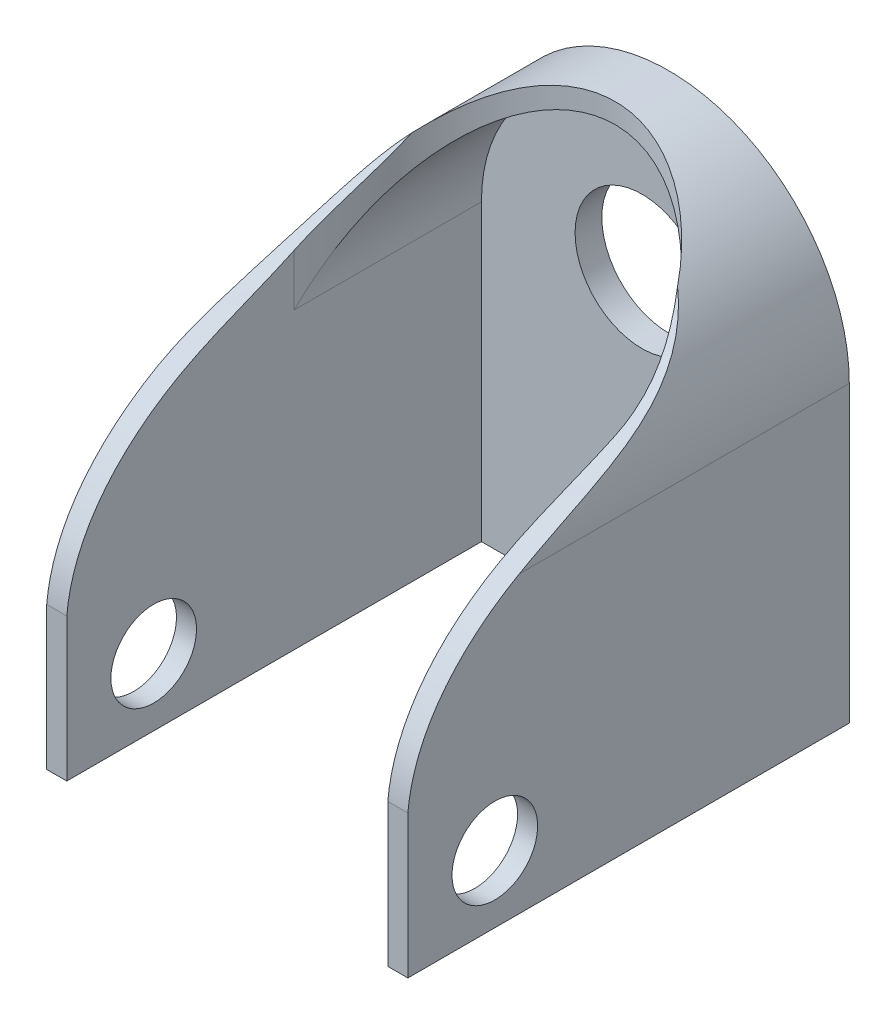
ISO-10303-21;
HEADER;
FILE_DESCRIPTION(('STEP AP214'),'2;1');
FILE_NAME('part.step','',(''),(''),'','','');
FILE_SCHEMA(('AUTOMOTIVE_DESIGN { 1 0 10303 214 1 1 1 1 }'));
ENDSEC;
DATA;
#1=APPLICATION_CONTEXT('core data for automotive mechanical design processes');
#2=APPLICATION_PROTOCOL_DEFINITION('international standard','automotive_design',2000,#1);
#3=PRODUCT_CONTEXT('',#1,'mechanical');
#4=PRODUCT('Part','Part','',(#3));
#5=PRODUCT_RELATED_PRODUCT_CATEGORY('part','',(#4));
#6=PRODUCT_DEFINITION_FORMATION('','',#4);
#7=PRODUCT_DEFINITION_CONTEXT('part definition',#1,'design');
#8=PRODUCT_DEFINITION('design','',#6,#7);
#9=PRODUCT_DEFINITION_SHAPE('','',#8);
#10=(LENGTH_UNIT() NAMED_UNIT(*) SI_UNIT(.MILLI.,.METRE.));
#11=(NAMED_UNIT(*) PLANE_ANGLE_UNIT() SI_UNIT($,.RADIAN.));
#12=(NAMED_UNIT(*) SI_UNIT($,.STERADIAN.) SOLID_ANGLE_UNIT());
#13=UNCERTAINTY_MEASURE_WITH_UNIT(LENGTH_MEASURE(1.E-05),#10,'distance_accuracy_value','');
#14=(GEOMETRIC_REPRESENTATION_CONTEXT(3) GLOBAL_UNCERTAINTY_ASSIGNED_CONTEXT((#13)) GLOBAL_UNIT_ASSIGNED_CONTEXT((#10,
#11,#12)) REPRESENTATION_CONTEXT('',''));
#15=CARTESIAN_POINT('',(0.,0.,0.));
#16=DIRECTION('',(0.,0.,1.));
#17=DIRECTION('',(1.,0.,0.));
#18=AXIS2_PLACEMENT_3D('',#15,#16,#17);
#19=CARTESIAN_POINT('',(13.5,22.,2.));
#20=DIRECTION('',(0.,0.,-1.));
#21=DIRECTION('',(-1.,0.,0.));
#22=AXIS2_PLACEMENT_3D('',#19,#20,#21);
#23=CYLINDRICAL_SURFACE('',#22,13.5);
#24=DIRECTION('',(0.,0.,-1.));
#25=VECTOR('',#24,1.);
#26=CARTESIAN_POINT('',(0.,22.,2.));
#27=LINE('',#26,#25);
#28=CARTESIAN_POINT('',(0.,22.0000000004221,24.6709792303414));
#29=VERTEX_POINT('',#28);
#30=CARTESIAN_POINT('',(0.,22.,0.));
#31=VERTEX_POINT('',#30);
#32=EDGE_CURVE('E198',#29,#31,#27,.T.);
#33=ORIENTED_EDGE('',*,*,#32,.F.);
#34=CARTESIAN_POINT('',(0.,22.,24.6709792310882));
#35=CARTESIAN_POINT('',(4.17203860960988E-06,22.0877378636198,24.5157433278381));
#36=CARTESIAN_POINT('',(0.000854723526788517,22.1736299451535,24.3594800205761));
#37=CARTESIAN_POINT('',(0.00406945856939409,22.3420071177185,24.0451687181609));
#38=CARTESIAN_POINT('',(0.00643344164084357,22.4244926584711,23.8871209621159));
#39=CARTESIAN_POINT('',(0.0155993873603406,22.6692252262729,23.4068665210544));
#40=CARTESIAN_POINT('',(0.0244671123845461,22.8266749503702,23.082251661167));
#41=CARTESIAN_POINT('',(0.0467550481397332,23.1331531745115,22.4251328165439));
#42=CARTESIAN_POINT('',(0.0602219684453914,23.2820761985686,22.0925818129647));
#43=CARTESIAN_POINT('',(0.0912496365364503,23.5738867683632,21.421779674441));
#44=CARTESIAN_POINT('',(0.10884328623355,23.7167142878531,21.0835041452644));
#45=CARTESIAN_POINT('',(0.148047091669684,23.9989402102766,20.4035845925255));
#46=CARTESIAN_POINT('',(0.169678810650676,24.1383154264326,20.0619322755097));
#47=CARTESIAN_POINT('',(0.217270678808816,24.4164120762317,19.3776776509112));
#48=CARTESIAN_POINT('',(0.243241380844388,24.5551310467493,19.0350750801224));
#49=CARTESIAN_POINT('',(0.302323800566631,24.8451460819324,18.3260542204603));
#50=CARTESIAN_POINT('',(0.33582030632161,24.9966166416701,17.9597380900108));
#51=CARTESIAN_POINT('',(0.410035974075327,25.3057589213072,17.2317447296482));
#52=CARTESIAN_POINT('',(0.450733009177463,25.4634105236308,16.8700568282734));
#53=CARTESIAN_POINT('',(0.541353887388601,25.7883793631412,16.1543744246927));
#54=CARTESIAN_POINT('',(0.591230132176295,25.9556438091683,15.8003503094171));
#55=CARTESIAN_POINT('',(0.702841202065188,26.3030021079695,15.1030344015129));
#56=CARTESIAN_POINT('',(0.764507024713626,26.4830176499849,14.7596930512014));
#57=CARTESIAN_POINT('',(0.903036195182093,26.8586435563419,14.086608640154));
#58=CARTESIAN_POINT('',(0.979832807383709,27.0541832662343,13.7568132887012));
#59=CARTESIAN_POINT('',(1.10945245006669,27.3606493522535,13.2744312007386));
#60=CARTESIAN_POINT('',(1.15506178672538,27.4649946713903,13.1156928412962));
#61=CARTESIAN_POINT('',(1.25160800068987,27.6780798169146,12.8028645358635));
#62=CARTESIAN_POINT('',(1.30254424087137,27.7868191168075,12.6487740367999));
#63=CARTESIAN_POINT('',(1.41398229050113,28.0162732035255,12.3353132110856));
#64=CARTESIAN_POINT('',(1.47490218961736,28.1372958979781,12.1763158357213));
#65=CARTESIAN_POINT('',(1.60410896830235,28.3841374407834,11.8647146935877));
#66=CARTESIAN_POINT('',(1.67240744173599,28.5099636302025,11.7121215276866));
#67=CARTESIAN_POINT('',(1.81685947478887,28.7657822952747,11.4141725436896));
#68=CARTESIAN_POINT('',(1.89301662190714,28.8957766548746,11.2688200762802));
#69=CARTESIAN_POINT('',(2.05246452921929,29.1573071929945,10.9880031979514));
#70=CARTESIAN_POINT('',(2.13563819738329,29.2887950186243,10.8524274143008));
#71=CARTESIAN_POINT('',(2.31031810185896,29.5542206031785,10.5894049731213));
#72=CARTESIAN_POINT('',(2.40182111035751,29.6881573971264,10.4619551988586));
#73=CARTESIAN_POINT('',(2.59335518257139,29.957536375937,10.2154765217611));
#74=CARTESIAN_POINT('',(2.6933818422584,30.0929777523229,10.0964433276996));
#75=CARTESIAN_POINT('',(2.84621738604934,30.2917582340709,9.92832480068025));
#76=CARTESIAN_POINT('',(2.89565035905257,30.3548964701976,9.87589463701701));
#77=CARTESIAN_POINT('',(2.99637516500738,30.4811782957301,9.77288078060569));
#78=CARTESIAN_POINT('',(3.04766670276674,30.5443218827105,9.72229679717192));
#79=CARTESIAN_POINT('',(3.15210491637062,30.6705118168614,9.62297114428572));
#80=CARTESIAN_POINT('',(3.20525145677479,30.7335581707817,9.57422934086816));
#81=CARTESIAN_POINT('',(3.31383722426081,30.859971094624,9.47818209166841));
#82=CARTESIAN_POINT('',(3.36929170594742,30.923336036908,9.43089174575264));
#83=CARTESIAN_POINT('',(3.48206793143075,31.0497630708563,9.33815335544271));
#84=CARTESIAN_POINT('',(3.53938982412805,31.1128251379082,9.29270545861043));
#85=CARTESIAN_POINT('',(3.65588375940127,31.2385456983721,9.20362851089251));
#86=CARTESIAN_POINT('',(3.71505607493924,31.301204130583,9.1599997305868));
#87=CARTESIAN_POINT('',(3.77513864962858,31.3636035646567,9.11727351153147));
#88=B_SPLINE_CURVE_WITH_KNOTS('',3,(#34,#35,#36,#37,#38,#39,#40,#41,#42,#43,#44,#45,#46,#47,#48,
#49,#50,#51,#52,#53,#54,#55,#56,#57,#58,#59,#60,#61,#62,#63,#64,#65,#66,#67,#68,#69,#70,#71,#72,
#73,#74,#75,#76,#77,#78,#79,#80,#81,#82,#83,#84,#85,#86,#87),.UNSPECIFIED.,.F.,.F.,(4,2,2,2,2,2,
2,2,2,2,2,2,2,2,2,2,2,2,2,2,2,2,2,2,2,2,4),(0.,0.534907905365416,1.06974496659949,
2.1521394327608,3.24587081683298,4.3486380359988,5.4574718210032,6.56904274676088,
7.76238897812063,8.9521298616894,10.1358668664339,11.3128767592051,12.4848070964805,
13.0707427226402,13.6566083479457,14.2830316223099,14.9104539119127,15.53816389878,
16.156930814128,16.7754589555074,17.3936694292958,17.6810619609112,17.9684090449043,
18.2557351923707,18.5454231095328,18.8351341821686,19.1248881945363),.UNSPECIFIED.);
#89=CARTESIAN_POINT('',(3.56000109905665,31.1349013048546,9.27717158859123));
#90=VERTEX_POINT('',#89);
#91=EDGE_CURVE('E270',#29,#90,#88,.T.);
#92=ORIENTED_EDGE('',*,*,#91,.T.);
#93=CARTESIAN_POINT('',(25.5,28.1846584384265,16.));
#94=CARTESIAN_POINT('',(25.5000019287082,28.1846500651789,15.9058672038379));
#95=CARTESIAN_POINT('',(25.4988919941462,28.1868087551287,15.811751657344));
#96=CARTESIAN_POINT('',(25.4944691857164,28.1953808457043,15.6237846185444));
#97=CARTESIAN_POINT('',(25.4911567505461,28.2017933990385,15.5299330773914));
#98=CARTESIAN_POINT('',(25.4779703448871,28.227247470784,15.2495758654299));
#99=CARTESIAN_POINT('',(25.4648470265256,28.2525062837932,15.0637491301028));
#100=CARTESIAN_POINT('',(25.4306356440936,28.3175338613273,14.6988602315224));
#101=CARTESIAN_POINT('',(25.4096906862344,28.3570415068287,14.5197366070789));
#102=CARTESIAN_POINT('',(25.3603272418741,28.4486700194743,14.1657124844965));
#103=CARTESIAN_POINT('',(25.3319034975715,28.5007997582477,13.9908150523143));
#104=CARTESIAN_POINT('',(25.2529827977488,28.6427949726174,13.5639541169116));
#105=CARTESIAN_POINT('',(25.198411648768,28.7388291941476,13.3147997321441));
#106=CARTESIAN_POINT('',(25.0756667762567,28.9475608874944,12.8271055653342));
#107=CARTESIAN_POINT('',(25.0074861165098,29.0602668486057,12.5885712720526));
#108=CARTESIAN_POINT('',(24.8578615625926,29.2985589148929,12.1192492811446));
#109=CARTESIAN_POINT('',(24.7762947707861,29.42425994333,11.8885598534578));
#110=CARTESIAN_POINT('',(24.6010559049609,29.6838232190666,11.436523619675));
#111=CARTESIAN_POINT('',(24.5073794203296,29.8176884305085,11.2151802567786));
#112=CARTESIAN_POINT('',(24.243758955405,30.1791808967698,10.6402582542807));
#113=CARTESIAN_POINT('',(24.0637671872826,30.4112875805343,10.2940656573392));
#114=CARTESIAN_POINT('',(23.6727078324353,30.8802885205061,9.62294614980076));
#115=CARTESIAN_POINT('',(23.461622241533,31.1171854813895,9.29803171836781));
#116=CARTESIAN_POINT('',(23.0089807462059,31.5883115717858,8.67001828214708));
#117=CARTESIAN_POINT('',(22.7675148549411,31.8225464405597,8.36685882438066));
#118=CARTESIAN_POINT('',(22.2532958906163,32.2834322744987,7.78226169957605));
#119=CARTESIAN_POINT('',(21.9805577124682,32.5100867842682,7.50081379735605));
#120=CARTESIAN_POINT('',(21.4716703733793,32.8985926029293,7.02540723468017));
#121=CARTESIAN_POINT('',(21.2421380505722,33.0630855579114,6.82650693270028));
#122=CARTESIAN_POINT('',(20.764469860437,33.3824422596035,6.44379154789719));
#123=CARTESIAN_POINT('',(20.5163343794699,33.5373062061722,6.25997615194795));
#124=CARTESIAN_POINT('',(20.0018902119072,33.8348482512479,5.90930010904159));
#125=CARTESIAN_POINT('',(19.7356009517289,33.977539019188,5.74242179934897));
#126=CARTESIAN_POINT('',(19.1851334179649,34.2483993962913,5.42740556306691));
#127=CARTESIAN_POINT('',(18.9009589091986,34.3765720456995,5.2792637121076));
#128=CARTESIAN_POINT('',(18.3719755483005,34.5928191107033,5.03040042833197));
#129=CARTESIAN_POINT('',(18.1300909005594,34.6838665667663,4.92603627321097));
#130=CARTESIAN_POINT('',(17.6361729990152,34.8534124045098,4.73224004091372));
#131=CARTESIAN_POINT('',(17.3841418899355,34.9319134209582,4.64280482846524));
#132=CARTESIAN_POINT('',(16.87115988742,35.0750201956105,4.4801193932996));
#133=CARTESIAN_POINT('',(16.6102125454497,35.1396314132441,4.4068628112096));
#134=CARTESIAN_POINT('',(16.0808137633627,35.2537810139578,4.27764406614004));
#135=CARTESIAN_POINT('',(15.8123622411978,35.303319232164,4.22168209233489));
#136=CARTESIAN_POINT('',(15.2682491907479,35.3865405037924,4.12776584752341));
#137=CARTESIAN_POINT('',(14.9925549467279,35.4201302176172,4.08991757805108));
#138=CARTESIAN_POINT('',(14.4376553910786,35.4702784388921,4.03343948970118));
#139=CARTESIAN_POINT('',(14.1584500710765,35.4868369057203,4.01480971666225));
#140=CARTESIAN_POINT('',(13.5989882436864,35.502536692255,3.99714561086045));
#141=CARTESIAN_POINT('',(13.3187319703418,35.5016816834477,3.99810714743306));
#142=CARTESIAN_POINT('',(12.7595805940726,35.4825821062568,4.01959746050134));
#143=CARTESIAN_POINT('',(12.4806854091194,35.4643385991638,4.04012504280173));
#144=CARTESIAN_POINT('',(11.9520991950442,35.4133482813574,4.09756043732118));
#145=CARTESIAN_POINT('',(11.702078504732,35.3820873978939,4.13279067147909));
#146=CARTESIAN_POINT('',(11.2067559585792,35.3061565411928,4.21848072522889));
#147=CARTESIAN_POINT('',(10.9614537517756,35.2614875693913,4.26893940742551));
#148=CARTESIAN_POINT('',(10.4769844719692,35.1595084492353,4.38434710629343));
#149=CARTESIAN_POINT('',(10.2378173530673,35.1021983954847,4.44929601452215));
#150=CARTESIAN_POINT('',(9.7667178474714,34.9758282219541,4.59284101308944));
#151=CARTESIAN_POINT('',(9.5347882220516,34.9067636808798,4.67144223879507));
#152=CARTESIAN_POINT('',(9.0653279120421,34.7533641688074,4.84651675129956));
#153=CARTESIAN_POINT('',(8.82831410603396,34.6683560433673,4.94378612202236));
#154=CARTESIAN_POINT('',(8.36437572182607,34.487491532329,5.15149595600148));
#155=CARTESIAN_POINT('',(8.13745512447375,34.3916309183465,5.26194155393315));
#156=CARTESIAN_POINT('',(7.47289852616349,34.0896833925173,5.61133869327195));
#157=CARTESIAN_POINT('',(7.05114239420869,33.8691217845885,5.86847415674464));
#158=CARTESIAN_POINT('',(6.34839580595662,33.4555304780208,6.35677777324836));
#159=CARTESIAN_POINT('',(6.05781352558109,33.2684680459794,6.57952813818692));
#160=CARTESIAN_POINT('',(5.50278068769741,32.8815827182874,7.04590386985167));
#161=CARTESIAN_POINT('',(5.23834225433901,32.6817539723457,7.28953882488377));
#162=CARTESIAN_POINT('',(4.73453897316457,32.2724157452569,7.79664347218671));
#163=CARTESIAN_POINT('',(4.49528685714384,32.0628683242383,8.0601939658244));
#164=CARTESIAN_POINT('',(4.04282858164966,31.6388782602887,8.60491710553869));
#165=CARTESIAN_POINT('',(3.82961617300375,31.4244368065781,8.88608549895681));
#166=CARTESIAN_POINT('',(3.42413002423575,30.9898377139829,9.47259739296509));
#167=CARTESIAN_POINT('',(3.23247215558806,30.7696650318974,9.77835586720493));
#168=CARTESIAN_POINT('',(2.87595466378421,30.3341991525317,10.408847248661));
#169=CARTESIAN_POINT('',(2.71111574354699,30.1189098342579,10.7335945539236));
#170=CARTESIAN_POINT('',(2.40974824837926,29.7020702743706,11.402156352098));
#171=CARTESIAN_POINT('',(2.27308466400711,29.5004577729922,11.7458694130882));
#172=CARTESIAN_POINT('',(2.09012828415842,29.2164824010371,12.2784537552214));
#173=CARTESIAN_POINT('',(2.03284454848477,29.1249486345442,12.4587012269031));
#174=CARTESIAN_POINT('',(1.92599005526151,28.9500184070649,12.825295707467));
#175=CARTESIAN_POINT('',(1.87641620832171,28.8666186917454,13.0116402368108));
#176=CARTESIAN_POINT('',(1.79113680838728,28.720030584386,13.3671940820815));
#177=CARTESIAN_POINT('',(1.75447400960815,28.6556182909759,13.535666154024));
#178=CARTESIAN_POINT('',(1.68792359267128,28.5367798716078,13.8774646227559));
#179=CARTESIAN_POINT('',(1.65803643076705,28.4823544181841,14.0507913455623));
#180=CARTESIAN_POINT('',(1.60568098103238,28.385780212015,14.4011261334822));
#181=CARTESIAN_POINT('',(1.58318043635548,28.3435781782339,14.578114504941));
#182=CARTESIAN_POINT('',(1.54595124996513,28.2731427104629,14.9355938769221));
#183=CARTESIAN_POINT('',(1.53121718707214,28.2448995337367,15.1160823428175));
#184=CARTESIAN_POINT('',(1.51375125563396,28.2112849254432,15.4139759328944));
#185=CARTESIAN_POINT('',(1.50860897538896,28.2013415175076,15.5307399152573));
#186=CARTESIAN_POINT('',(1.50172640351485,28.1880083927186,15.7649933794294));
#187=CARTESIAN_POINT('',(1.49999350182046,28.1846329122274,15.8824838846797));
#188=CARTESIAN_POINT('',(1.5,28.1846584384265,16.));
#189=B_SPLINE_CURVE_WITH_KNOTS('',3,(#93,#94,#95,#96,#97,#98,#99,#100,#101,#102,#103,#104,#105,
#106,#107,#108,#109,#110,#111,#112,#113,#114,#115,#116,#117,#118,#119,#120,#121,#122,#123,#124,
#125,#126,#127,#128,#129,#130,#131,#132,#133,#134,#135,#136,#137,#138,#139,#140,#141,#142,#143,
#144,#145,#146,#147,#148,#149,#150,#151,#152,#153,#154,#155,#156,#157,#158,#159,#160,#161,#162,
#163,#164,#165,#166,#167,#168,#169,#170,#171,#172,#173,#174,#175,#176,#177,#178,#179,#180,#181,
#182,#183,#184,#185,#186,#187,#188),.UNSPECIFIED.,.F.,.F.,(4,2,2,2,2,2,2,2,2,2,2,2,2,2,2,2,2,2,
2,2,2,2,2,2,2,2,2,2,2,2,2,2,2,2,2,2,2,2,2,2,2,2,2,2,2,2,2,4),(0.,0.282334125647721,
0.564612032380173,1.12761968346313,1.68079447468849,2.23435920763545,3.05058273932272,
3.86722333414956,4.69183045354452,5.51673876341833,6.87688854664192,8.23782901247381,
9.5948281605371,10.9511836373489,11.9865368838153,13.0218686334227,14.0561093537447,
15.0901330913154,15.9255264558189,16.7607441555103,17.5956329675482,18.4305309115664,
19.2702566876271,20.10998446654,20.9495351976748,21.7890346908969,22.551431380466,
23.3137711415893,24.0761051976722,24.8387266318591,25.6477175630692,26.4570247880373,
28.0745549543644,29.3065627942897,30.5391393211377,31.7770170948549,33.0145972086953,
34.281502619415,35.5493814260235,36.8110359167384,37.4410862561681,38.0708834772308,
38.6226556993484,39.1744650653221,39.7238316306712,40.2728142162466,40.624493319711,
40.9769338624895),.UNSPECIFIED.);
#190=CARTESIAN_POINT('',(23.4399989009539,31.1349013048327,9.27717158860685));
#191=VERTEX_POINT('',#190);
#192=EDGE_CURVE('E170',#191,#90,#189,.T.);
#193=ORIENTED_EDGE('',*,*,#192,.F.);
#194=CARTESIAN_POINT('',(23.2248613503714,31.3636035646567,9.11727351153147));
#195=CARTESIAN_POINT('',(23.3290989264238,31.2553549596672,9.19138800850632));
#196=CARTESIAN_POINT('',(23.4305874572624,31.1463230278564,9.26823059135399));
#197=CARTESIAN_POINT('',(23.6279251806906,30.927306126632,9.42741245124776));
#198=CARTESIAN_POINT('',(23.7237772605064,30.8173216788537,9.50974886715769));
#199=CARTESIAN_POINT('',(23.9097775272953,30.5969373295245,9.68000676532836));
#200=CARTESIAN_POINT('',(23.9999276184685,30.4865375798539,9.76792636319819));
#201=CARTESIAN_POINT('',(24.1745153483332,30.265864189647,9.94937697133699));
#202=CARTESIAN_POINT('',(24.2589537037486,30.1555905350016,10.04290727477));
#203=CARTESIAN_POINT('',(24.4199704173167,29.9386401738972,10.2329770764493));
#204=CARTESIAN_POINT('',(24.4966982560948,29.8319459151936,10.3293699958239));
#205=CARTESIAN_POINT('',(24.6448304800147,29.6196787640445,10.5273394337629));
#206=CARTESIAN_POINT('',(24.7162348706334,29.5141058704453,10.628915946994));
#207=CARTESIAN_POINT('',(24.8538304195477,29.3045361994933,10.8370990277187));
#208=CARTESIAN_POINT('',(24.9200215882904,29.2005394189823,10.9437055851314));
#209=CARTESIAN_POINT('',(25.0473389200009,28.994542520971,11.161727946493));
#210=CARTESIAN_POINT('',(25.1084656247321,28.8925421907974,11.273143234091));
#211=CARTESIAN_POINT('',(25.2452712186407,28.6575303041373,11.5381523231156));
#212=CARTESIAN_POINT('',(25.319079610247,28.5254154383034,11.6935124185708));
#213=CARTESIAN_POINT('',(25.4586552303597,28.2659615732513,12.0116617151462));
#214=CARTESIAN_POINT('',(25.5244215693667,28.1386231034092,12.1744517353312));
#215=CARTESIAN_POINT('',(25.6485543460804,27.8891462405598,12.5067065479117));
#216=CARTESIAN_POINT('',(25.7069202503526,27.76700822283,12.6761718203169));
#217=CARTESIAN_POINT('',(25.8178435448608,27.5261740402654,13.023833693304));
#218=CARTESIAN_POINT('',(25.8702888890081,27.4075682229834,13.2021283515964));
#219=CARTESIAN_POINT('',(25.9689656247207,27.1759772699645,13.5639509017219));
#220=CARTESIAN_POINT('',(26.0151980023755,27.062991244081,13.7474779574784));
#221=CARTESIAN_POINT('',(26.1021552310196,26.8424903979493,14.118927776668));
#222=CARTESIAN_POINT('',(26.1428826507491,26.7349730406043,14.30684844159));
#223=CARTESIAN_POINT('',(26.2370287790382,26.4771239056512,14.7730654221896));
#224=CARTESIAN_POINT('',(26.2877602510837,26.3296385121625,15.0534784530913));
#225=CARTESIAN_POINT('',(26.3809366426796,26.0440106190953,15.6203403246609));
#226=CARTESIAN_POINT('',(26.4233808873267,25.9058688810529,15.906789654816));
#227=CARTESIAN_POINT('',(26.5016201180341,25.6369636702892,16.4844573964418));
#228=CARTESIAN_POINT('',(26.5374063578218,25.5062100576928,16.7756815417739));
#229=CARTESIAN_POINT('',(26.603605937033,25.2500815454995,17.3616346563116));
#230=CARTESIAN_POINT('',(26.6340104585575,25.1247157235873,17.6563685483171));
#231=CARTESIAN_POINT('',(26.6904171054254,24.8773267158331,18.2481013910233));
#232=CARTESIAN_POINT('',(26.7164133586156,24.7553081672755,18.5451028207144));
#233=CARTESIAN_POINT('',(26.7647040047263,24.5125588768866,19.1401513058399));
#234=CARTESIAN_POINT('',(26.7869959829903,24.3918290227006,19.4381989150001));
#235=CARTESIAN_POINT('',(26.8271090483185,24.1567385967544,20.0165675507681));
#236=CARTESIAN_POINT('',(26.8451166072637,24.0424237344733,20.296894203029));
#237=CARTESIAN_POINT('',(26.8784335117949,23.8113885393169,20.8564460563319));
#238=CARTESIAN_POINT('',(26.8937450999317,23.6946702967545,21.1356719821328));
#239=CARTESIAN_POINT('',(26.9216628687744,23.4571379912897,21.6920287789573));
#240=CARTESIAN_POINT('',(26.9342730663573,23.3363303233951,21.9691621610959));
#241=CARTESIAN_POINT('',(26.9565802055813,23.0889553163974,22.5203554779764));
#242=CARTESIAN_POINT('',(26.9662825441709,22.9623991557177,22.7944201861628));
#243=CARTESIAN_POINT('',(26.9823753515964,22.7018836827062,23.338531655992));
#244=CARTESIAN_POINT('',(26.9887717607122,22.5679381309121,23.6085847715403));
#245=CARTESIAN_POINT('',(26.9975594915647,22.291088234296,24.1437151677065));
#246=CARTESIAN_POINT('',(26.9999554426324,22.1481944434123,24.4087978482285));
#247=CARTESIAN_POINT('',(27.,22.,24.6709792310882));
#248=B_SPLINE_CURVE_WITH_KNOTS('',3,(#194,#195,#196,#197,#198,#199,#200,#201,#202,#203,#204,
#205,#206,#207,#208,#209,#210,#211,#212,#213,#214,#215,#216,#217,#218,#219,#220,#221,#222,#223,
#224,#225,#226,#227,#228,#229,#230,#231,#232,#233,#234,#235,#236,#237,#238,#239,#240,#241,#242,
#243,#244,#245,#246,#247),.UNSPECIFIED.,.F.,.F.,(4,2,2,2,2,2,2,2,2,2,2,2,2,2,2,2,2,2,2,2,2,2,2,
2,2,2,4),(0.,0.502636284997042,1.00501281465462,1.50722067822837,2.00936540605088,
2.49813070913571,2.98689550935586,3.47565933007492,3.96437079834315,4.6146601675509,
5.26502139774742,5.91542948034799,6.57659581793983,7.23765709444379,7.89840883173382,
8.86061915023295,9.82290779750942,10.7864517626587,11.7515601593387,12.7179442243475,
13.6849557829304,14.5947622199397,15.5038082531515,16.411493035827,17.3174825836123,
18.2218384887046,19.1251471457761),.UNSPECIFIED.);
#249=CARTESIAN_POINT('',(27.,22.0000000004221,24.6709792303414));
#250=VERTEX_POINT('',#249);
#251=EDGE_CURVE('E62',#191,#250,#248,.T.);
#252=ORIENTED_EDGE('',*,*,#251,.T.);
#253=DIRECTION('',(0.,0.,-1.));
#254=VECTOR('',#253,1.);
#255=CARTESIAN_POINT('',(27.,22.,2.));
#256=LINE('',#255,#254);
#257=CARTESIAN_POINT('',(27.,22.,0.));
#258=VERTEX_POINT('',#257);
#259=EDGE_CURVE('E145',#250,#258,#256,.T.);
#260=ORIENTED_EDGE('',*,*,#259,.T.);
#261=CARTESIAN_POINT('',(13.5,22.,0.));
#262=DIRECTION('',(0.,0.,1.));
#263=DIRECTION('',(-1.,0.,0.));
#264=AXIS2_PLACEMENT_3D('',#261,#262,#263);
#265=CIRCLE('',#264,13.5);
#266=EDGE_CURVE('E192',#258,#31,#265,.T.);
#267=ORIENTED_EDGE('',*,*,#266,.T.);
#268=EDGE_LOOP('',(#33,#92,#193,#252,#260,#267));
#269=FACE_BOUND('',#268,.T.);
#270=ADVANCED_FACE('F39',(#269),#23,.T.);
#271=CARTESIAN_POINT('',(13.5,22.,33.));
#272=DIRECTION('',(0.,0.,-1.));
#273=DIRECTION('',(-1.,0.,0.));
#274=AXIS2_PLACEMENT_3D('',#271,#272,#273);
#275=CYLINDRICAL_SURFACE('',#274,12.);
#276=CARTESIAN_POINT('',(13.5,22.,16.));
#277=DIRECTION('',(0.,-0.707106781186547,-0.707106781186547));
#278=DIRECTION('',(0.,0.707106781186547,-0.707106781186547));
#279=AXIS2_PLACEMENT_3D('',#276,#277,#278);
#280=ELLIPSE('',#279,16.9705627484771,12.);
#281=CARTESIAN_POINT('',(1.5,22.,16.));
#282=VERTEX_POINT('',#281);
#283=CARTESIAN_POINT('',(25.5,22.,16.));
#284=VERTEX_POINT('',#283);
#285=EDGE_CURVE('E280',#282,#284,#280,.T.);
#286=ORIENTED_EDGE('',*,*,#285,.F.);
#287=DIRECTION('',(0.,0.,-1.));
#288=VECTOR('',#287,1.);
#289=CARTESIAN_POINT('',(1.5,22.,33.));
#290=LINE('',#289,#288);
#291=CARTESIAN_POINT('',(1.5,22.,2.));
#292=VERTEX_POINT('',#291);
#293=EDGE_CURVE('E178',#282,#292,#290,.T.);
#294=ORIENTED_EDGE('',*,*,#293,.T.);
#295=CARTESIAN_POINT('',(13.5,22.,2.));
#296=DIRECTION('',(0.,0.,-1.));
#297=DIRECTION('',(1.,0.,0.));
#298=AXIS2_PLACEMENT_3D('',#295,#296,#297);
#299=CIRCLE('',#298,12.);
#300=CARTESIAN_POINT('',(25.5,22.,2.));
#301=VERTEX_POINT('',#300);
#302=EDGE_CURVE('E169',#292,#301,#299,.T.);
#303=ORIENTED_EDGE('',*,*,#302,.T.);
#304=DIRECTION('',(0.,0.,-1.));
#305=VECTOR('',#304,1.);
#306=CARTESIAN_POINT('',(25.5,22.,33.));
#307=LINE('',#306,#305);
#308=EDGE_CURVE('E176',#284,#301,#307,.T.);
#309=ORIENTED_EDGE('',*,*,#308,.F.);
#310=EDGE_LOOP('',(#286,#294,#303,#309));
#311=FACE_BOUND('',#310,.T.);
#312=ADVANCED_FACE('F259',(#311),#275,.F.);
#313=CARTESIAN_POINT('',(13.5,22.,33.));
#314=DIRECTION('',(0.,0.,1.));
#315=DIRECTION('',(1.,0.,0.));
#316=AXIS2_PLACEMENT_3D('',#313,#314,#315);
#317=PLANE('',#316);
#318=DIRECTION('',(-1.,0.,0.));
#319=VECTOR('',#318,1.);
#320=CARTESIAN_POINT('',(27.,10.6901458091182,33.));
#321=LINE('',#320,#319);
#322=CARTESIAN_POINT('',(27.,10.6901458091182,33.));
#323=VERTEX_POINT('',#322);
#324=CARTESIAN_POINT('',(25.5,10.6901458091182,33.));
#325=VERTEX_POINT('',#324);
#326=EDGE_CURVE('E126',#323,#325,#321,.T.);
#327=ORIENTED_EDGE('',*,*,#326,.T.);
#328=DIRECTION('',(0.,-1.,0.));
#329=VECTOR('',#328,1.);
#330=CARTESIAN_POINT('',(25.5,1.5,33.));
#331=LINE('',#330,#329);
#332=CARTESIAN_POINT('',(25.5,0.,33.));
#333=VERTEX_POINT('',#332);
#334=EDGE_CURVE('E163',#325,#333,#331,.T.);
#335=ORIENTED_EDGE('',*,*,#334,.T.);
#336=DIRECTION('',(1.,0.,0.));
#337=VECTOR('',#336,1.);
#338=CARTESIAN_POINT('',(25.5,0.,33.));
#339=LINE('',#338,#337);
#340=CARTESIAN_POINT('',(27.,0.,33.));
#341=VERTEX_POINT('',#340);
#342=EDGE_CURVE('E150',#333,#341,#339,.T.);
#343=ORIENTED_EDGE('',*,*,#342,.T.);
#344=DIRECTION('',(0.,1.,0.));
#345=VECTOR('',#344,1.);
#346=CARTESIAN_POINT('',(27.,0.,33.));
#347=LINE('',#346,#345);
#348=EDGE_CURVE('E142',#341,#323,#347,.T.);
#349=ORIENTED_EDGE('',*,*,#348,.T.);
#350=EDGE_LOOP('',(#327,#335,#343,#349));
#351=FACE_BOUND('',#350,.T.);
#352=ADVANCED_FACE('F148',(#351),#317,.T.);
#353=CARTESIAN_POINT('',(1.5,10.6901458091182,33.));
#354=VERTEX_POINT('',#353);
#355=CARTESIAN_POINT('',(0.,10.6901458091182,33.));
#356=VERTEX_POINT('',#355);
#357=EDGE_CURVE('E135',#354,#356,#321,.T.);
#358=ORIENTED_EDGE('',*,*,#357,.T.);
#359=DIRECTION('',(0.,-1.,0.));
#360=VECTOR('',#359,1.);
#361=CARTESIAN_POINT('',(0.,22.,33.));
#362=LINE('',#361,#360);
#363=CARTESIAN_POINT('',(0.,0.,33.));
#364=VERTEX_POINT('',#363);
#365=EDGE_CURVE('E151',#356,#364,#362,.T.);
#366=ORIENTED_EDGE('',*,*,#365,.T.);
#367=DIRECTION('',(1.,0.,0.));
#368=VECTOR('',#367,1.);
#369=CARTESIAN_POINT('',(1.5,0.,33.));
#370=LINE('',#369,#368);
#371=CARTESIAN_POINT('',(1.5,0.,33.));
#372=VERTEX_POINT('',#371);
#373=EDGE_CURVE('E153',#364,#372,#370,.T.);
#374=ORIENTED_EDGE('',*,*,#373,.T.);
#375=DIRECTION('',(0.,1.,0.));
#376=VECTOR('',#375,1.);
#377=CARTESIAN_POINT('',(1.5,1.5,33.));
#378=LINE('',#377,#376);
#379=EDGE_CURVE('E160',#372,#354,#378,.T.);
#380=ORIENTED_EDGE('',*,*,#379,.T.);
#381=EDGE_LOOP('',(#358,#366,#374,#380));
#382=FACE_BOUND('',#381,.T.);
#383=ADVANCED_FACE('F297',(#382),#317,.T.);
#384=CARTESIAN_POINT('',(13.5,22.,2.));
#385=DIRECTION('',(0.,0.,-1.));
#386=DIRECTION('',(-1.,0.,0.));
#387=AXIS2_PLACEMENT_3D('',#384,#385,#386);
#388=PLANE('',#387);
#389=CARTESIAN_POINT('',(13.5,23.5,2.));
#390=DIRECTION('',(0.,0.,-1.));
#391=DIRECTION('',(-1.,0.,0.));
#392=AXIS2_PLACEMENT_3D('',#389,#390,#391);
#393=CIRCLE('',#392,5.);
#394=CARTESIAN_POINT('',(8.5,23.5,2.));
#395=VERTEX_POINT('',#394);
#396=EDGE_CURVE('E551',#395,#395,#393,.T.);
#397=ORIENTED_EDGE('',*,*,#396,.T.);
#398=EDGE_LOOP('',(#397));
#399=FACE_BOUND('',#398,.T.);
#400=DIRECTION('',(0.,-1.,0.));
#401=VECTOR('',#400,1.);
#402=CARTESIAN_POINT('',(25.5,1.5,2.));
#403=LINE('',#402,#401);
#404=CARTESIAN_POINT('',(25.5,0.,2.));
#405=VERTEX_POINT('',#404);
#406=EDGE_CURVE('E155',#301,#405,#403,.T.);
#407=ORIENTED_EDGE('',*,*,#406,.F.);
#408=ORIENTED_EDGE('',*,*,#302,.F.);
#409=DIRECTION('',(0.,1.,0.));
#410=VECTOR('',#409,1.);
#411=CARTESIAN_POINT('',(1.5,22.,2.));
#412=LINE('',#411,#410);
#413=CARTESIAN_POINT('',(1.5,0.,2.));
#414=VERTEX_POINT('',#413);
#415=EDGE_CURVE('E166',#414,#292,#412,.T.);
#416=ORIENTED_EDGE('',*,*,#415,.F.);
#417=DIRECTION('',(1.,0.,0.));
#418=VECTOR('',#417,1.);
#419=CARTESIAN_POINT('',(27.,0.,2.));
#420=LINE('',#419,#418);
#421=EDGE_CURVE('E183',#414,#405,#420,.T.);
#422=ORIENTED_EDGE('',*,*,#421,.T.);
#423=EDGE_LOOP('',(#407,#408,#416,#422));
#424=FACE_BOUND('',#423,.T.);
#425=ADVANCED_FACE('F310',(#399,#424),#388,.F.);
#426=CARTESIAN_POINT('',(27.,0.,2.));
#427=DIRECTION('',(0.,1.,0.));
#428=DIRECTION('',(-1.,0.,0.));
#429=AXIS2_PLACEMENT_3D('',#426,#427,#428);
#430=PLANE('',#429);
#431=DIRECTION('',(1.,0.,0.));
#432=VECTOR('',#431,1.);
#433=CARTESIAN_POINT('',(27.,0.,0.));
#434=LINE('',#433,#432);
#435=CARTESIAN_POINT('',(0.,0.,0.));
#436=VERTEX_POINT('',#435);
#437=CARTESIAN_POINT('',(27.,0.,0.));
#438=VERTEX_POINT('',#437);
#439=EDGE_CURVE('E182',#436,#438,#434,.T.);
#440=ORIENTED_EDGE('',*,*,#439,.T.);
#441=DIRECTION('',(0.,0.,-1.));
#442=VECTOR('',#441,1.);
#443=CARTESIAN_POINT('',(27.,0.,2.));
#444=LINE('',#443,#442);
#445=EDGE_CURVE('E201',#341,#438,#444,.T.);
#446=ORIENTED_EDGE('',*,*,#445,.F.);
#447=ORIENTED_EDGE('',*,*,#342,.F.);
#448=DIRECTION('',(0.,0.,-1.));
#449=VECTOR('',#448,1.);
#450=CARTESIAN_POINT('',(25.5,0.,33.));
#451=LINE('',#450,#449);
#452=EDGE_CURVE('E165',#333,#405,#451,.T.);
#453=ORIENTED_EDGE('',*,*,#452,.T.);
#454=ORIENTED_EDGE('',*,*,#421,.F.);
#455=DIRECTION('',(0.,0.,-1.));
#456=VECTOR('',#455,1.);
#457=CARTESIAN_POINT('',(1.5,0.,33.));
#458=LINE('',#457,#456);
#459=EDGE_CURVE('E180',#372,#414,#458,.T.);
#460=ORIENTED_EDGE('',*,*,#459,.F.);
#461=ORIENTED_EDGE('',*,*,#373,.F.);
#462=DIRECTION('',(0.,0.,-1.));
#463=VECTOR('',#462,1.);
#464=CARTESIAN_POINT('',(0.,0.,2.));
#465=LINE('',#464,#463);
#466=EDGE_CURVE('E186',#364,#436,#465,.T.);
#467=ORIENTED_EDGE('',*,*,#466,.T.);
#468=EDGE_LOOP('',(#440,#446,#447,#453,#454,#460,#461,#467));
#469=FACE_BOUND('',#468,.T.);
#470=ADVANCED_FACE('F41',(#469),#430,.F.);
#471=CARTESIAN_POINT('',(27.,22.,2.));
#472=DIRECTION('',(-1.,0.,0.));
#473=DIRECTION('',(0.,-1.,0.));
#474=AXIS2_PLACEMENT_3D('',#471,#472,#473);
#475=PLANE('',#474);
#476=CARTESIAN_POINT('',(27.,5.,26.5));
#477=DIRECTION('',(-1.,0.,0.));
#478=DIRECTION('',(0.,0.,1.));
#479=AXIS2_PLACEMENT_3D('',#476,#477,#478);
#480=CIRCLE('',#479,3.2);
#481=CARTESIAN_POINT('',(27.,5.,29.7));
#482=VERTEX_POINT('',#481);
#483=EDGE_CURVE('E555',#482,#482,#480,.T.);
#484=ORIENTED_EDGE('',*,*,#483,.T.);
#485=EDGE_LOOP('',(#484));
#486=FACE_BOUND('',#485,.T.);
#487=ORIENTED_EDGE('',*,*,#259,.F.);
#488=CARTESIAN_POINT('',(27.,31.3636035646567,9.11727351153147));
#489=CARTESIAN_POINT('',(27.,25.7468288873735,12.963253359884));
#490=CARTESIAN_POINT('',(27.,24.3572964033627,25.1322303645374));
#491=CARTESIAN_POINT('',(27.,14.5821033678384,33.57064705735));
#492=CARTESIAN_POINT('',(27.,8.37014346572462,33.));
#493=B_SPLINE_CURVE_WITH_KNOTS('',3,(#488,#489,#490,#491,#492),.UNSPECIFIED.,.F.,.F.,(4,1,4),
(0.,0.522970265847846,1.),.UNSPECIFIED.);
#494=EDGE_CURVE('E129',#250,#323,#493,.T.);
#495=ORIENTED_EDGE('',*,*,#494,.T.);
#496=ORIENTED_EDGE('',*,*,#348,.F.);
#497=ORIENTED_EDGE('',*,*,#445,.T.);
#498=DIRECTION('',(0.,1.,0.));
#499=VECTOR('',#498,1.);
#500=CARTESIAN_POINT('',(27.,22.,0.));
#501=LINE('',#500,#499);
#502=EDGE_CURVE('E190',#438,#258,#501,.T.);
#503=ORIENTED_EDGE('',*,*,#502,.T.);
#504=EDGE_LOOP('',(#487,#495,#496,#497,#503));
#505=FACE_BOUND('',#504,.T.);
#506=ADVANCED_FACE('F140',(#486,#505),#475,.F.);
#507=CARTESIAN_POINT('',(0.,0.,2.));
#508=DIRECTION('',(1.,0.,0.));
#509=DIRECTION('',(0.,0.,-1.));
#510=AXIS2_PLACEMENT_3D('',#507,#508,#509);
#511=PLANE('',#510);
#512=CARTESIAN_POINT('',(0.,5.,26.5));
#513=DIRECTION('',(-1.,0.,0.));
#514=DIRECTION('',(0.,0.,1.));
#515=AXIS2_PLACEMENT_3D('',#512,#513,#514);
#516=CIRCLE('',#515,3.2);
#517=CARTESIAN_POINT('',(0.,5.,29.7));
#518=VERTEX_POINT('',#517);
#519=EDGE_CURVE('E552',#518,#518,#516,.T.);
#520=ORIENTED_EDGE('',*,*,#519,.F.);
#521=EDGE_LOOP('',(#520));
#522=FACE_BOUND('',#521,.T.);
#523=ORIENTED_EDGE('',*,*,#365,.F.);
#524=CARTESIAN_POINT('',(0.,31.3636035646567,9.11727351153147));
#525=CARTESIAN_POINT('',(0.,25.7468288873735,12.963253359884));
#526=CARTESIAN_POINT('',(0.,24.3572964033627,25.1322303645374));
#527=CARTESIAN_POINT('',(0.,14.5821033678384,33.57064705735));
#528=CARTESIAN_POINT('',(0.,8.37014346572462,33.));
#529=B_SPLINE_CURVE_WITH_KNOTS('',3,(#524,#525,#526,#527,#528),.UNSPECIFIED.,.F.,.F.,(4,1,4),
(0.,0.522970265847846,1.),.UNSPECIFIED.);
#530=EDGE_CURVE('E146',#29,#356,#529,.T.);
#531=ORIENTED_EDGE('',*,*,#530,.F.);
#532=ORIENTED_EDGE('',*,*,#32,.T.);
#533=DIRECTION('',(0.,-1.,0.));
#534=VECTOR('',#533,1.);
#535=CARTESIAN_POINT('',(0.,0.,0.));
#536=LINE('',#535,#534);
#537=EDGE_CURVE('E187',#31,#436,#536,.T.);
#538=ORIENTED_EDGE('',*,*,#537,.T.);
#539=ORIENTED_EDGE('',*,*,#466,.F.);
#540=EDGE_LOOP('',(#523,#531,#532,#538,#539));
#541=FACE_BOUND('',#540,.T.);
#542=ADVANCED_FACE('F261',(#522,#541),#511,.F.);
#543=CARTESIAN_POINT('',(13.5,22.,0.));
#544=DIRECTION('',(0.,0.,-1.));
#545=DIRECTION('',(-1.,0.,0.));
#546=AXIS2_PLACEMENT_3D('',#543,#544,#545);
#547=PLANE('',#546);
#548=CARTESIAN_POINT('',(13.5,23.5,0.));
#549=DIRECTION('',(0.,0.,-1.));
#550=DIRECTION('',(-1.,0.,0.));
#551=AXIS2_PLACEMENT_3D('',#548,#549,#550);
#552=CIRCLE('',#551,5.);
#553=CARTESIAN_POINT('',(8.5,23.5,0.));
#554=VERTEX_POINT('',#553);
#555=EDGE_CURVE('E548',#554,#554,#552,.T.);
#556=ORIENTED_EDGE('',*,*,#555,.F.);
#557=EDGE_LOOP('',(#556));
#558=FACE_BOUND('',#557,.T.);
#559=ORIENTED_EDGE('',*,*,#439,.F.);
#560=ORIENTED_EDGE('',*,*,#537,.F.);
#561=ORIENTED_EDGE('',*,*,#266,.F.);
#562=ORIENTED_EDGE('',*,*,#502,.F.);
#563=EDGE_LOOP('',(#559,#560,#561,#562));
#564=FACE_BOUND('',#563,.T.);
#565=ADVANCED_FACE('F318',(#558,#564),#547,.T.);
#566=CARTESIAN_POINT('',(1.5,22.,33.));
#567=DIRECTION('',(-1.,0.,0.));
#568=DIRECTION('',(0.,-1.,0.));
#569=AXIS2_PLACEMENT_3D('',#566,#567,#568);
#570=PLANE('',#569);
#571=CARTESIAN_POINT('',(1.5,5.,26.5));
#572=DIRECTION('',(-1.,0.,0.));
#573=DIRECTION('',(0.,-1.,0.));
#574=AXIS2_PLACEMENT_3D('',#571,#572,#573);
#575=CIRCLE('',#574,3.2);
#576=CARTESIAN_POINT('',(1.5,1.8,26.5));
#577=VERTEX_POINT('',#576);
#578=EDGE_CURVE('E230',#577,#577,#575,.T.);
#579=ORIENTED_EDGE('',*,*,#578,.T.);
#580=EDGE_LOOP('',(#579));
#581=FACE_BOUND('',#580,.T.);
#582=DIRECTION('',(0.,-1.,0.));
#583=VECTOR('',#582,1.);
#584=CARTESIAN_POINT('',(1.5,35.5,16.));
#585=LINE('',#584,#583);
#586=CARTESIAN_POINT('',(1.5,25.8632297642003,16.));
#587=VERTEX_POINT('',#586);
#588=EDGE_CURVE('E277',#587,#282,#585,.T.);
#589=ORIENTED_EDGE('',*,*,#588,.F.);
#590=CARTESIAN_POINT('',(1.5,31.3636035646567,9.11727351153147));
#591=CARTESIAN_POINT('',(1.5,25.7468288873735,12.963253359884));
#592=CARTESIAN_POINT('',(1.5,24.3572964033627,25.1322303645374));
#593=CARTESIAN_POINT('',(1.5,14.5821033678384,33.57064705735));
#594=CARTESIAN_POINT('',(1.5,8.37014346572462,33.));
#595=B_SPLINE_CURVE_WITH_KNOTS('',3,(#590,#591,#592,#593,#594),.UNSPECIFIED.,.F.,.F.,(4,1,4),
(0.,0.522970265847846,1.),.UNSPECIFIED.);
#596=EDGE_CURVE('E54',#587,#354,#595,.T.);
#597=ORIENTED_EDGE('',*,*,#596,.T.);
#598=ORIENTED_EDGE('',*,*,#379,.F.);
#599=ORIENTED_EDGE('',*,*,#459,.T.);
#600=ORIENTED_EDGE('',*,*,#415,.T.);
#601=ORIENTED_EDGE('',*,*,#293,.F.);
#602=EDGE_LOOP('',(#589,#597,#598,#599,#600,#601));
#603=FACE_BOUND('',#602,.T.);
#604=ADVANCED_FACE('F301',(#581,#603),#570,.F.);
#605=CARTESIAN_POINT('',(25.5,1.5,33.));
#606=DIRECTION('',(1.,0.,0.));
#607=DIRECTION('',(0.,0.,-1.));
#608=AXIS2_PLACEMENT_3D('',#605,#606,#607);
#609=PLANE('',#608);
#610=CARTESIAN_POINT('',(25.5,5.,26.5));
#611=DIRECTION('',(1.,0.,0.));
#612=DIRECTION('',(0.,0.,-1.));
#613=AXIS2_PLACEMENT_3D('',#610,#611,#612);
#614=CIRCLE('',#613,3.2);
#615=CARTESIAN_POINT('',(25.5,5.,23.3));
#616=VERTEX_POINT('',#615);
#617=EDGE_CURVE('E43',#616,#616,#614,.T.);
#618=ORIENTED_EDGE('',*,*,#617,.T.);
#619=EDGE_LOOP('',(#618));
#620=FACE_BOUND('',#619,.T.);
#621=ORIENTED_EDGE('',*,*,#334,.F.);
#622=CARTESIAN_POINT('',(25.5,31.3636035646567,9.11727351153147));
#623=CARTESIAN_POINT('',(25.5,25.7468288873735,12.963253359884));
#624=CARTESIAN_POINT('',(25.5,24.3572964033627,25.1322303645374));
#625=CARTESIAN_POINT('',(25.5,14.5821033678384,33.57064705735));
#626=CARTESIAN_POINT('',(25.5,8.37014346572462,33.));
#627=B_SPLINE_CURVE_WITH_KNOTS('',3,(#622,#623,#624,#625,#626),.UNSPECIFIED.,.F.,.F.,(4,1,4),
(0.,0.522970265847846,1.),.UNSPECIFIED.);
#628=CARTESIAN_POINT('',(25.5,25.8632297642003,16.));
#629=VERTEX_POINT('',#628);
#630=EDGE_CURVE('E131',#325,#629,#627,.F.);
#631=ORIENTED_EDGE('',*,*,#630,.T.);
#632=DIRECTION('',(0.,-1.,0.));
#633=VECTOR('',#632,1.);
#634=CARTESIAN_POINT('',(25.5,35.5,16.));
#635=LINE('',#634,#633);
#636=EDGE_CURVE('E279',#629,#284,#635,.T.);
#637=ORIENTED_EDGE('',*,*,#636,.T.);
#638=ORIENTED_EDGE('',*,*,#308,.T.);
#639=ORIENTED_EDGE('',*,*,#406,.T.);
#640=ORIENTED_EDGE('',*,*,#452,.F.);
#641=EDGE_LOOP('',(#621,#631,#637,#638,#639,#640));
#642=FACE_BOUND('',#641,.T.);
#643=ADVANCED_FACE('F307',(#620,#642),#609,.F.);
#644=CARTESIAN_POINT('',(13.5,35.5,16.));
#645=DIRECTION('',(0.,-1.,0.));
#646=DIRECTION('',(0.,0.,-1.));
#647=AXIS2_PLACEMENT_3D('',#644,#645,#646);
#648=CYLINDRICAL_SURFACE('',#647,12.);
#649=CARTESIAN_POINT('',(1.5,25.8632297642003,16.));
#650=CARTESIAN_POINT('',(1.49999046774514,25.9461190557931,15.8248462834048));
#651=CARTESIAN_POINT('',(1.50383442716409,26.0305661205954,15.6504283679116));
#652=CARTESIAN_POINT('',(1.51896764938086,26.2028683907169,15.3036367609697));
#653=CARTESIAN_POINT('',(1.53025602513485,26.2907231888118,15.1312628284598));
#654=CARTESIAN_POINT('',(1.56001525529673,26.4701454872265,14.7891043784784));
#655=CARTESIAN_POINT('',(1.57848549813279,26.5617126708237,14.6193196418029));
#656=CARTESIAN_POINT('',(1.62228124145134,26.7488222363651,14.2828591534458));
#657=CARTESIAN_POINT('',(1.64760653821213,26.8443645001048,14.1161833095299));
#658=CARTESIAN_POINT('',(1.70399482493932,27.0370954242647,13.7907419491775));
#659=CARTESIAN_POINT('',(1.73489087015827,27.1341760865974,13.6318835076425));
#660=CARTESIAN_POINT('',(1.80244433716025,27.3324660830414,13.3180312627399));
#661=CARTESIAN_POINT('',(1.83910134944941,27.4336751233261,13.163037185597));
#662=CARTESIAN_POINT('',(1.91775477681527,27.6403316586325,12.8573087387164));
#663=CARTESIAN_POINT('',(1.95975072779564,27.745778784707,12.7065740001189));
#664=CARTESIAN_POINT('',(2.04862980668755,27.9609723239265,12.4097181071051));
#665=CARTESIAN_POINT('',(2.09551227566402,28.0707181561588,12.2635963340951));
#666=CARTESIAN_POINT('',(2.19436696503986,28.2960676930076,11.9742893034514));
#667=CARTESIAN_POINT('',(2.24639971564665,28.4117307517655,11.8311709746371));
#668=CARTESIAN_POINT('',(2.3545097942292,28.6475030352026,11.5502012218428));
#669=CARTESIAN_POINT('',(2.4105874793433,28.7676126520237,11.4123502645811));
#670=CARTESIAN_POINT('',(2.52628602061425,29.0122363663785,11.142097922821));
#671=CARTESIAN_POINT('',(2.5859076192707,29.1367513846779,11.0096976902308));
#672=CARTESIAN_POINT('',(2.70818951573968,29.3900999771187,10.7504887949989));
#673=CARTESIAN_POINT('',(2.77085052847727,29.5189345650788,10.6236814614316));
#674=CARTESIAN_POINT('',(2.90045019950452,29.7843629832828,10.372382787716));
#675=CARTESIAN_POINT('',(2.96745902025404,29.9210726915457,10.2480500895874));
#676=CARTESIAN_POINT('',(3.10361131865826,30.1987299129834,10.0054651919412));
#677=CARTESIAN_POINT('',(3.17275461357295,30.3396770633487,9.88721247419249));
#678=CARTESIAN_POINT('',(3.3126484442769,30.6255950856828,9.6568125618683));
#679=CARTESIAN_POINT('',(3.38339834886898,30.77056438225,9.54466302636884));
#680=CARTESIAN_POINT('',(3.52599914988605,31.0642750433235,9.32644931502176));
#681=CARTESIAN_POINT('',(3.59784909138719,31.2130132023053,9.22038020258825));
#682=CARTESIAN_POINT('',(3.67004190828193,31.3636035646567,9.11727351153147));
#683=B_SPLINE_CURVE_WITH_KNOTS('',3,(#649,#650,#651,#652,#653,#654,#655,#656,#657,#658,#659,
#660,#661,#662,#663,#664,#665,#666,#667,#668,#669,#670,#671,#672,#673,#674,#675,#676,#677,#678,
#679,#680,#681,#682),.UNSPECIFIED.,.F.,.F.,(4,2,2,2,2,2,2,2,2,2,2,2,2,2,2,2,4),(0.,
0.581286716398391,1.16250418174642,1.74367216436288,2.32482287745327,2.8908105695881,
3.45675804907213,4.02265636620467,4.58847847181024,5.16199293538364,5.73555809824903,
6.30924385755633,6.8830652187439,7.47260816582436,8.06210077923402,8.65136567096169,
9.24014516856592),.UNSPECIFIED.);
#684=EDGE_CURVE('E11',#587,#90,#683,.T.);
#685=ORIENTED_EDGE('',*,*,#684,.F.);
#686=ORIENTED_EDGE('',*,*,#588,.T.);
#687=ORIENTED_EDGE('',*,*,#285,.T.);
#688=ORIENTED_EDGE('',*,*,#636,.F.);
#689=CARTESIAN_POINT('',(23.3299580917181,31.3636035646567,9.11727351153147));
#690=CARTESIAN_POINT('',(23.4058435445263,31.2053086529867,9.22565404172849));
#691=CARTESIAN_POINT('',(23.481351239261,31.049060583642,9.337309487869));
#692=CARTESIAN_POINT('',(23.6311332759454,30.7407200023754,9.56734910198793));
#693=CARTESIAN_POINT('',(23.7054063525153,30.5886316618377,9.68573968224593));
#694=CARTESIAN_POINT('',(23.852125740891,30.2889113153318,9.92927447882276));
#695=CARTESIAN_POINT('',(23.9245712013813,30.1412813800293,10.0544217602365));
#696=CARTESIAN_POINT('',(24.0670162143735,29.8507304864543,10.3114363390137));
#697=CARTESIAN_POINT('',(24.1370155063736,29.7078100298038,10.4433043484389));
#698=CARTESIAN_POINT('',(24.2720255924101,29.4308070793303,10.7098999343373));
#699=CARTESIAN_POINT('',(24.3371212174171,29.2965891469102,10.8444437463527));
#700=CARTESIAN_POINT('',(24.463813226568,29.0329512272382,11.1196578199312));
#701=CARTESIAN_POINT('',(24.5254106225615,28.9035298564005,11.2603262889484));
#702=CARTESIAN_POINT('',(24.6445203320917,28.6495755065962,11.5476031353754));
#703=CARTESIAN_POINT('',(24.7020337742106,28.5250411814055,11.6942098540513));
#704=CARTESIAN_POINT('',(24.8123977343588,28.2808938059823,11.9931266830514));
#705=CARTESIAN_POINT('',(24.8652489915768,28.1612799772164,12.1454358837737));
#706=CARTESIAN_POINT('',(24.9603083247215,27.9395811242678,12.4387539180659));
#707=CARTESIAN_POINT('',(25.003049613525,27.8369959129158,12.5792125231593));
#708=CARTESIAN_POINT('',(25.0839770318212,27.6356849763011,12.8641724449062));
#709=CARTESIAN_POINT('',(25.1221627556295,27.5369595952914,13.0086741201928));
#710=CARTESIAN_POINT('',(25.1936001312003,27.3433025798077,13.3014048781437));
#711=CARTESIAN_POINT('',(25.2268514826476,27.248371176499,13.4496341870372));
#712=CARTESIAN_POINT('',(25.2880678873773,27.0621957917958,13.7494734978512));
#713=CARTESIAN_POINT('',(25.3160326478563,26.9709520148641,13.9010836865054));
#714=CARTESIAN_POINT('',(25.3669945306916,26.7897279378734,14.2112127143807));
#715=CARTESIAN_POINT('',(25.3898464886757,26.699839470615,14.3698090999808));
#716=CARTESIAN_POINT('',(25.4293401149057,26.5236018261684,14.6897233276798));
#717=CARTESIAN_POINT('',(25.445981619286,26.437252742422,14.85104124147));
#718=CARTESIAN_POINT('',(25.472781791857,26.2678660042428,15.175951693153));
#719=CARTESIAN_POINT('',(25.4829400160636,26.1848285769618,15.339544386042));
#720=CARTESIAN_POINT('',(25.4965532789994,26.0218040924799,15.6685376126147));
#721=CARTESIAN_POINT('',(25.5000077046265,25.9418173149347,15.8339383102601));
#722=CARTESIAN_POINT('',(25.5,25.8632297642003,16.));
#723=B_SPLINE_CURVE_WITH_KNOTS('',3,(#689,#690,#691,#692,#693,#694,#695,#696,#697,#698,#699,
#700,#701,#702,#703,#704,#705,#706,#707,#708,#709,#710,#711,#712,#713,#714,#715,#716,#717,#718,
#719,#720,#721,#722),.UNSPECIFIED.,.F.,.F.,(4,2,2,2,2,2,2,2,2,2,2,2,2,2,2,2,4),(0.,
0.618898517900456,1.23839646224201,1.85817783493758,2.47802501059949,3.08049759077428,
3.68279501105988,4.28492533612803,4.88696002128122,5.42413879463668,5.96136536945261,
6.49862462748859,7.03591363346275,7.58692917679568,8.13795925789363,8.68902707025035,
9.24014527863498),.UNSPECIFIED.);
#724=EDGE_CURVE('E48',#191,#629,#723,.T.);
#725=ORIENTED_EDGE('',*,*,#724,.F.);
#726=ORIENTED_EDGE('',*,*,#192,.T.);
#727=EDGE_LOOP('',(#685,#686,#687,#688,#725,#726));
#728=FACE_BOUND('',#727,.T.);
#729=ADVANCED_FACE('F213',(#728),#648,.F.);
#730=DIRECTION('',(-1.,0.,0.));
#731=VECTOR('',#730,1.);
#732=SURFACE_OF_LINEAR_EXTRUSION('',#493,#731);
#733=ORIENTED_EDGE('',*,*,#724,.T.);
#734=ORIENTED_EDGE('',*,*,#630,.F.);
#735=ORIENTED_EDGE('',*,*,#326,.F.);
#736=ORIENTED_EDGE('',*,*,#494,.F.);
#737=ORIENTED_EDGE('',*,*,#251,.F.);
#738=EDGE_LOOP('',(#733,#734,#735,#736,#737));
#739=FACE_BOUND('',#738,.T.);
#740=ADVANCED_FACE('F128',(#739),#732,.F.);
#741=ORIENTED_EDGE('',*,*,#530,.T.);
#742=ORIENTED_EDGE('',*,*,#357,.F.);
#743=ORIENTED_EDGE('',*,*,#596,.F.);
#744=ORIENTED_EDGE('',*,*,#684,.T.);
#745=ORIENTED_EDGE('',*,*,#91,.F.);
#746=EDGE_LOOP('',(#741,#742,#743,#744,#745));
#747=FACE_BOUND('',#746,.T.);
#748=ADVANCED_FACE('F216',(#747),#732,.F.);
#749=CARTESIAN_POINT('',(27.,5.,26.5));
#750=DIRECTION('',(-1.,0.,0.));
#751=DIRECTION('',(0.,0.,1.));
#752=AXIS2_PLACEMENT_3D('',#749,#750,#751);
#753=CYLINDRICAL_SURFACE('',#752,3.2);
#754=ORIENTED_EDGE('',*,*,#483,.F.);
#755=EDGE_LOOP('',(#754));
#756=FACE_BOUND('',#755,.T.);
#757=ORIENTED_EDGE('',*,*,#617,.F.);
#758=EDGE_LOOP('',(#757));
#759=FACE_BOUND('',#758,.T.);
#760=ADVANCED_FACE('F220',(#756,#759),#753,.F.);
#761=ORIENTED_EDGE('',*,*,#519,.T.);
#762=EDGE_LOOP('',(#761));
#763=FACE_BOUND('',#762,.T.);
#764=ORIENTED_EDGE('',*,*,#578,.F.);
#765=EDGE_LOOP('',(#764));
#766=FACE_BOUND('',#765,.T.);
#767=ADVANCED_FACE('F221',(#763,#766),#753,.F.);
#768=CARTESIAN_POINT('',(13.5,23.5,33.0000000002029));
#769=DIRECTION('',(0.,0.,-1.));
#770=DIRECTION('',(-1.,0.,0.));
#771=AXIS2_PLACEMENT_3D('',#768,#769,#770);
#772=CYLINDRICAL_SURFACE('',#771,5.);
#773=ORIENTED_EDGE('',*,*,#555,.T.);
#774=EDGE_LOOP('',(#773));
#775=FACE_BOUND('',#774,.T.);
#776=ORIENTED_EDGE('',*,*,#396,.F.);
#777=EDGE_LOOP('',(#776));
#778=FACE_BOUND('',#777,.T.);
#779=ADVANCED_FACE('F404',(#775,#778),#772,.F.);
#780=CLOSED_SHELL('',(#270,#312,#352,#383,#425,#470,#506,#542,#565,#604,#643,#729,#740,#748,
#760,#767,#779));
#781=MANIFOLD_SOLID_BREP('B2',#780);
#782=ADVANCED_BREP_SHAPE_REPRESENTATION('',(#18,#781),#14);
#783=SHAPE_DEFINITION_REPRESENTATION(#9,#782);
ENDSEC;
END-ISO-10303-21;
